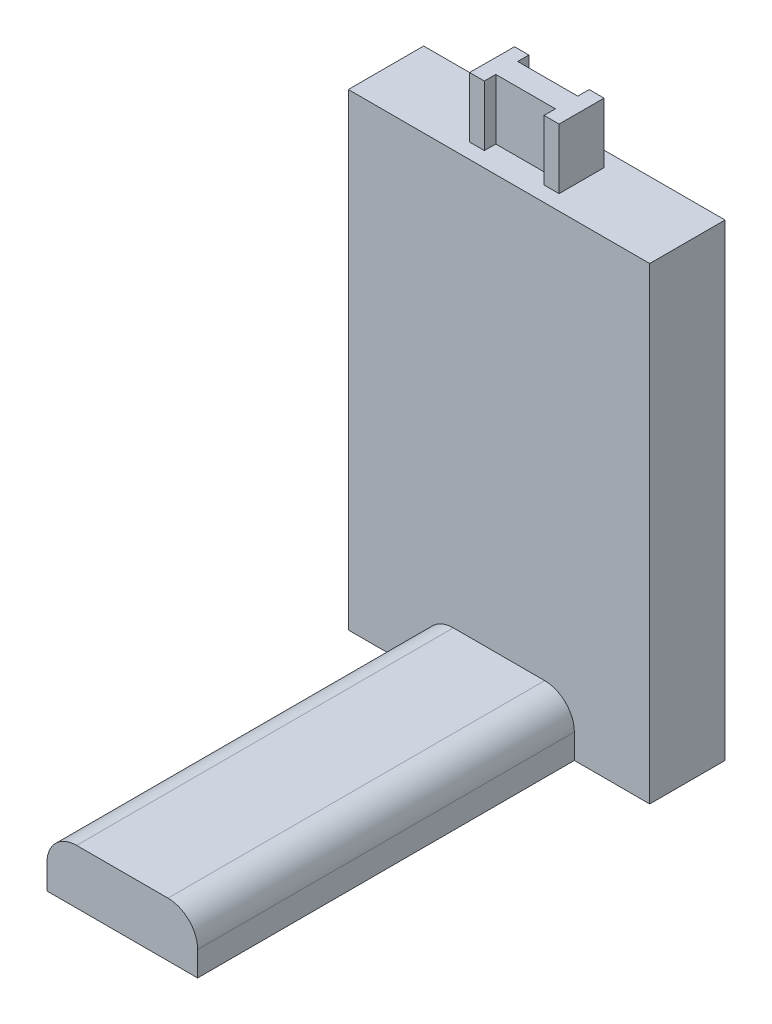
ISO-10303-21;
HEADER;
FILE_DESCRIPTION(('STEP AP214'),'2;1');
FILE_NAME('part.step','',(''),(''),'','','');
FILE_SCHEMA(('AUTOMOTIVE_DESIGN { 1 0 10303 214 1 1 1 1 }'));
ENDSEC;
DATA;
#1=APPLICATION_CONTEXT('core data for automotive mechanical design processes');
#2=APPLICATION_PROTOCOL_DEFINITION('international standard','automotive_design',2000,#1);
#3=PRODUCT_CONTEXT('',#1,'mechanical');
#4=PRODUCT('Part','Part','',(#3));
#5=PRODUCT_RELATED_PRODUCT_CATEGORY('part','',(#4));
#6=PRODUCT_DEFINITION_FORMATION('','',#4);
#7=PRODUCT_DEFINITION_CONTEXT('part definition',#1,'design');
#8=PRODUCT_DEFINITION('design','',#6,#7);
#9=PRODUCT_DEFINITION_SHAPE('','',#8);
#10=(LENGTH_UNIT() NAMED_UNIT(*) SI_UNIT(.MILLI.,.METRE.));
#11=(NAMED_UNIT(*) PLANE_ANGLE_UNIT() SI_UNIT($,.RADIAN.));
#12=(NAMED_UNIT(*) SI_UNIT($,.STERADIAN.) SOLID_ANGLE_UNIT());
#13=UNCERTAINTY_MEASURE_WITH_UNIT(LENGTH_MEASURE(1.E-05),#10,'distance_accuracy_value','');
#14=(GEOMETRIC_REPRESENTATION_CONTEXT(3) GLOBAL_UNCERTAINTY_ASSIGNED_CONTEXT((#13)) GLOBAL_UNIT_ASSIGNED_CONTEXT((#10,
#11,#12)) REPRESENTATION_CONTEXT('',''));
#15=CARTESIAN_POINT('',(0.,0.,0.));
#16=DIRECTION('',(0.,0.,1.));
#17=DIRECTION('',(1.,0.,0.));
#18=AXIS2_PLACEMENT_3D('',#15,#16,#17);
#19=CARTESIAN_POINT('',(10.,8.32158439817525,127.));
#20=DIRECTION('',(0.,0.,1.));
#21=DIRECTION('',(1.,0.,0.));
#22=AXIS2_PLACEMENT_3D('',#19,#20,#21);
#23=CYLINDRICAL_SURFACE('',#22,10.);
#24=DIRECTION('',(0.,0.,1.));
#25=VECTOR('',#24,1.);
#26=CARTESIAN_POINT('',(10.,18.3215843981752,127.));
#27=LINE('',#26,#25);
#28=CARTESIAN_POINT('',(10.,18.3215843981752,0.));
#29=VERTEX_POINT('',#28);
#30=CARTESIAN_POINT('',(10.,18.3215843981752,127.));
#31=VERTEX_POINT('',#30);
#32=EDGE_CURVE('E439',#29,#31,#27,.T.);
#33=ORIENTED_EDGE('',*,*,#32,.F.);
#34=CARTESIAN_POINT('',(10.,8.32158439817525,0.));
#35=DIRECTION('',(0.,0.,-1.));
#36=DIRECTION('',(-1.,0.,0.));
#37=AXIS2_PLACEMENT_3D('',#34,#35,#36);
#38=CIRCLE('',#37,10.);
#39=CARTESIAN_POINT('',(0.,8.32158439817525,0.));
#40=VERTEX_POINT('',#39);
#41=EDGE_CURVE('E11',#29,#40,#38,.F.);
#42=ORIENTED_EDGE('',*,*,#41,.T.);
#43=DIRECTION('',(0.,0.,1.));
#44=VECTOR('',#43,1.);
#45=CARTESIAN_POINT('',(0.,8.32158439817525,127.));
#46=LINE('',#45,#44);
#47=CARTESIAN_POINT('',(0.,8.32158439817525,127.));
#48=VERTEX_POINT('',#47);
#49=EDGE_CURVE('E443',#48,#40,#46,.F.);
#50=ORIENTED_EDGE('',*,*,#49,.F.);
#51=CARTESIAN_POINT('',(10.,8.32158439817525,127.));
#52=DIRECTION('',(0.,0.,1.));
#53=DIRECTION('',(1.,0.,0.));
#54=AXIS2_PLACEMENT_3D('',#51,#52,#53);
#55=CIRCLE('',#54,10.);
#56=EDGE_CURVE('E53',#31,#48,#55,.T.);
#57=ORIENTED_EDGE('',*,*,#56,.F.);
#58=EDGE_LOOP('',(#33,#42,#50,#57));
#59=FACE_BOUND('',#58,.T.);
#60=ADVANCED_FACE('F45',(#59),#23,.T.);
#61=CARTESIAN_POINT('',(40.8,8.32158439817525,127.));
#62=DIRECTION('',(0.,0.,-1.));
#63=DIRECTION('',(-1.,0.,0.));
#64=AXIS2_PLACEMENT_3D('',#61,#62,#63);
#65=CYLINDRICAL_SURFACE('',#64,10.);
#66=DIRECTION('',(0.,0.,-1.));
#67=VECTOR('',#66,1.);
#68=CARTESIAN_POINT('',(40.8,18.3215843981752,127.));
#69=LINE('',#68,#67);
#70=CARTESIAN_POINT('',(40.8,18.3215843981752,127.));
#71=VERTEX_POINT('',#70);
#72=CARTESIAN_POINT('',(40.8,18.3215843981752,0.));
#73=VERTEX_POINT('',#72);
#74=EDGE_CURVE('E425',#71,#73,#69,.T.);
#75=ORIENTED_EDGE('',*,*,#74,.F.);
#76=CARTESIAN_POINT('',(40.8,8.32158439817525,127.));
#77=DIRECTION('',(0.,0.,1.));
#78=DIRECTION('',(1.,0.,0.));
#79=AXIS2_PLACEMENT_3D('',#76,#77,#78);
#80=CIRCLE('',#79,10.);
#81=CARTESIAN_POINT('',(50.8,8.32158439817525,127.));
#82=VERTEX_POINT('',#81);
#83=EDGE_CURVE('E433',#82,#71,#80,.T.);
#84=ORIENTED_EDGE('',*,*,#83,.F.);
#85=DIRECTION('',(0.,0.,-1.));
#86=VECTOR('',#85,1.);
#87=CARTESIAN_POINT('',(50.8,8.32158439817525,127.));
#88=LINE('',#87,#86);
#89=CARTESIAN_POINT('',(50.8,8.32158439817525,0.));
#90=VERTEX_POINT('',#89);
#91=EDGE_CURVE('E429',#90,#82,#88,.F.);
#92=ORIENTED_EDGE('',*,*,#91,.F.);
#93=CARTESIAN_POINT('',(40.8,8.32158439817525,0.));
#94=DIRECTION('',(0.,0.,-1.));
#95=DIRECTION('',(-1.,0.,0.));
#96=AXIS2_PLACEMENT_3D('',#93,#94,#95);
#97=CIRCLE('',#96,10.);
#98=EDGE_CURVE('E436',#90,#73,#97,.F.);
#99=ORIENTED_EDGE('',*,*,#98,.T.);
#100=EDGE_LOOP('',(#75,#84,#92,#99));
#101=FACE_BOUND('',#100,.T.);
#102=ADVANCED_FACE('F476',(#101),#65,.T.);
#103=CARTESIAN_POINT('',(-25.4,157.8,0.));
#104=DIRECTION('',(0.,0.,-1.));
#105=DIRECTION('',(-1.,0.,0.));
#106=AXIS2_PLACEMENT_3D('',#103,#104,#105);
#107=PLANE('',#106);
#108=DIRECTION('',(0.,1.,0.));
#109=VECTOR('',#108,1.);
#110=CARTESIAN_POINT('',(50.8,18.3215843981752,0.));
#111=LINE('',#110,#109);
#112=CARTESIAN_POINT('',(50.8,0.,0.));
#113=VERTEX_POINT('',#112);
#114=EDGE_CURVE('E223',#113,#90,#111,.T.);
#115=ORIENTED_EDGE('',*,*,#114,.F.);
#116=DIRECTION('',(1.,0.,0.));
#117=VECTOR('',#116,1.);
#118=CARTESIAN_POINT('',(-25.4,0.,0.));
#119=LINE('',#118,#117);
#120=CARTESIAN_POINT('',(76.2,0.,0.));
#121=VERTEX_POINT('',#120);
#122=EDGE_CURVE('E407',#113,#121,#119,.T.);
#123=ORIENTED_EDGE('',*,*,#122,.T.);
#124=DIRECTION('',(0.,-1.,0.));
#125=VECTOR('',#124,1.);
#126=CARTESIAN_POINT('',(76.2,157.8,0.));
#127=LINE('',#126,#125);
#128=CARTESIAN_POINT('',(76.2,157.8,0.));
#129=VERTEX_POINT('',#128);
#130=EDGE_CURVE('E397',#129,#121,#127,.T.);
#131=ORIENTED_EDGE('',*,*,#130,.F.);
#132=DIRECTION('',(1.,0.,0.));
#133=VECTOR('',#132,1.);
#134=CARTESIAN_POINT('',(-25.4,157.8,0.));
#135=LINE('',#134,#133);
#136=CARTESIAN_POINT('',(-25.4,157.8,0.));
#137=VERTEX_POINT('',#136);
#138=EDGE_CURVE('E394',#137,#129,#135,.T.);
#139=ORIENTED_EDGE('',*,*,#138,.F.);
#140=DIRECTION('',(0.,-1.,0.));
#141=VECTOR('',#140,1.);
#142=CARTESIAN_POINT('',(-25.4,157.8,0.));
#143=LINE('',#142,#141);
#144=CARTESIAN_POINT('',(-25.4,0.,0.));
#145=VERTEX_POINT('',#144);
#146=EDGE_CURVE('E413',#137,#145,#143,.T.);
#147=ORIENTED_EDGE('',*,*,#146,.T.);
#148=CARTESIAN_POINT('',(0.,0.,0.));
#149=VERTEX_POINT('',#148);
#150=EDGE_CURVE('E388',#145,#149,#119,.T.);
#151=ORIENTED_EDGE('',*,*,#150,.T.);
#152=DIRECTION('',(0.,-1.,0.));
#153=VECTOR('',#152,1.);
#154=CARTESIAN_POINT('',(0.,18.3215843981752,0.));
#155=LINE('',#154,#153);
#156=EDGE_CURVE('E204',#40,#149,#155,.T.);
#157=ORIENTED_EDGE('',*,*,#156,.F.);
#158=ORIENTED_EDGE('',*,*,#41,.F.);
#159=DIRECTION('',(-1.,0.,0.));
#160=VECTOR('',#159,1.);
#161=CARTESIAN_POINT('',(0.,18.3215843981752,0.));
#162=LINE('',#161,#160);
#163=EDGE_CURVE('E227',#73,#29,#162,.T.);
#164=ORIENTED_EDGE('',*,*,#163,.F.);
#165=ORIENTED_EDGE('',*,*,#98,.F.);
#166=EDGE_LOOP('',(#115,#123,#131,#139,#147,#151,#157,#158,#164,#165));
#167=FACE_BOUND('',#166,.T.);
#168=ADVANCED_FACE('F449',(#167),#107,.F.);
#169=CARTESIAN_POINT('',(76.2,157.8,-25.4));
#170=DIRECTION('',(-1.,0.,0.));
#171=DIRECTION('',(0.,0.,1.));
#172=AXIS2_PLACEMENT_3D('',#169,#170,#171);
#173=PLANE('',#172);
#174=DIRECTION('',(0.,0.,-1.));
#175=VECTOR('',#174,1.);
#176=CARTESIAN_POINT('',(76.2,0.,-25.4));
#177=LINE('',#176,#175);
#178=CARTESIAN_POINT('',(76.2,0.,-25.4));
#179=VERTEX_POINT('',#178);
#180=EDGE_CURVE('E382',#121,#179,#177,.T.);
#181=ORIENTED_EDGE('',*,*,#180,.T.);
#182=DIRECTION('',(0.,-1.,0.));
#183=VECTOR('',#182,1.);
#184=CARTESIAN_POINT('',(76.2,157.8,-25.4));
#185=LINE('',#184,#183);
#186=CARTESIAN_POINT('',(76.2,157.8,-25.4));
#187=VERTEX_POINT('',#186);
#188=EDGE_CURVE('E421',#187,#179,#185,.T.);
#189=ORIENTED_EDGE('',*,*,#188,.F.);
#190=DIRECTION('',(0.,0.,-1.));
#191=VECTOR('',#190,1.);
#192=CARTESIAN_POINT('',(76.2,157.8,-25.4));
#193=LINE('',#192,#191);
#194=EDGE_CURVE('E383',#129,#187,#193,.T.);
#195=ORIENTED_EDGE('',*,*,#194,.F.);
#196=ORIENTED_EDGE('',*,*,#130,.T.);
#197=EDGE_LOOP('',(#181,#189,#195,#196));
#198=FACE_BOUND('',#197,.T.);
#199=ADVANCED_FACE('F453',(#198),#173,.F.);
#200=CARTESIAN_POINT('',(-25.4,157.8,-25.4));
#201=DIRECTION('',(0.,0.,1.));
#202=DIRECTION('',(1.,0.,0.));
#203=AXIS2_PLACEMENT_3D('',#200,#201,#202);
#204=PLANE('',#203);
#205=DIRECTION('',(-1.,0.,0.));
#206=VECTOR('',#205,1.);
#207=CARTESIAN_POINT('',(-25.4,0.,-25.4));
#208=LINE('',#207,#206);
#209=CARTESIAN_POINT('',(-25.4,0.,-25.4));
#210=VERTEX_POINT('',#209);
#211=EDGE_CURVE('E401',#179,#210,#208,.T.);
#212=ORIENTED_EDGE('',*,*,#211,.T.);
#213=DIRECTION('',(0.,-1.,0.));
#214=VECTOR('',#213,1.);
#215=CARTESIAN_POINT('',(-25.4,157.8,-25.4));
#216=LINE('',#215,#214);
#217=CARTESIAN_POINT('',(-25.4,157.8,-25.4));
#218=VERTEX_POINT('',#217);
#219=EDGE_CURVE('E417',#218,#210,#216,.T.);
#220=ORIENTED_EDGE('',*,*,#219,.F.);
#221=DIRECTION('',(-1.,0.,0.));
#222=VECTOR('',#221,1.);
#223=CARTESIAN_POINT('',(-25.4,157.8,-25.4));
#224=LINE('',#223,#222);
#225=EDGE_CURVE('E387',#187,#218,#224,.T.);
#226=ORIENTED_EDGE('',*,*,#225,.F.);
#227=ORIENTED_EDGE('',*,*,#188,.T.);
#228=EDGE_LOOP('',(#212,#220,#226,#227));
#229=FACE_BOUND('',#228,.T.);
#230=ADVANCED_FACE('F458',(#229),#204,.F.);
#231=CARTESIAN_POINT('',(-25.4,157.8,0.));
#232=DIRECTION('',(1.,0.,0.));
#233=DIRECTION('',(0.,0.,-1.));
#234=AXIS2_PLACEMENT_3D('',#231,#232,#233);
#235=PLANE('',#234);
#236=DIRECTION('',(0.,0.,1.));
#237=VECTOR('',#236,1.);
#238=CARTESIAN_POINT('',(-25.4,0.,0.));
#239=LINE('',#238,#237);
#240=EDGE_CURVE('E404',#210,#145,#239,.T.);
#241=ORIENTED_EDGE('',*,*,#240,.T.);
#242=ORIENTED_EDGE('',*,*,#146,.F.);
#243=DIRECTION('',(0.,0.,1.));
#244=VECTOR('',#243,1.);
#245=CARTESIAN_POINT('',(-25.4,157.8,0.));
#246=LINE('',#245,#244);
#247=EDGE_CURVE('E391',#218,#137,#246,.T.);
#248=ORIENTED_EDGE('',*,*,#247,.F.);
#249=ORIENTED_EDGE('',*,*,#219,.T.);
#250=EDGE_LOOP('',(#241,#242,#248,#249));
#251=FACE_BOUND('',#250,.T.);
#252=ADVANCED_FACE('F464',(#251),#235,.F.);
#253=CARTESIAN_POINT('',(0.,157.8,0.));
#254=DIRECTION('',(0.,1.,0.));
#255=DIRECTION('',(0.,0.,1.));
#256=AXIS2_PLACEMENT_3D('',#253,#254,#255);
#257=PLANE('',#256);
#258=DIRECTION('',(-0.00390174965338652,0.,0.999992388145851));
#259=VECTOR('',#258,1.);
#260=CARTESIAN_POINT('',(10.3887668141845,157.8,-5.08731838640076));
#261=LINE('',#260,#259);
#262=CARTESIAN_POINT('',(10.447692891702,157.8,-20.1896786646093));
#263=VERTEX_POINT('',#262);
#264=CARTESIAN_POINT('',(10.3887668141845,157.8,-5.08731838640076));
#265=VERTEX_POINT('',#264);
#266=EDGE_CURVE('E238',#263,#265,#261,.T.);
#267=ORIENTED_EDGE('',*,*,#266,.F.);
#268=DIRECTION('',(-1.,0.,0.));
#269=VECTOR('',#268,1.);
#270=CARTESIAN_POINT('',(10.447692891702,157.8,-20.1896786646093));
#271=LINE('',#270,#269);
#272=CARTESIAN_POINT('',(15.2935340648002,157.8,-20.1896786646093));
#273=VERTEX_POINT('',#272);
#274=EDGE_CURVE('E255',#273,#263,#271,.T.);
#275=ORIENTED_EDGE('',*,*,#274,.F.);
#276=DIRECTION('',(0.,0.,-1.));
#277=VECTOR('',#276,1.);
#278=CARTESIAN_POINT('',(15.2935340648002,157.8,-20.1896786646093));
#279=LINE('',#278,#277);
#280=CARTESIAN_POINT('',(15.2935340648002,157.8,-16.4095895020894));
#281=VERTEX_POINT('',#280);
#282=EDGE_CURVE('E328',#281,#273,#279,.T.);
#283=ORIENTED_EDGE('',*,*,#282,.F.);
#284=DIRECTION('',(-1.,0.,0.));
#285=VECTOR('',#284,1.);
#286=CARTESIAN_POINT('',(15.2935340648002,157.8,-16.4095895020894));
#287=LINE('',#286,#285);
#288=CARTESIAN_POINT('',(35.5270404867116,157.8,-16.4095895020894));
#289=VERTEX_POINT('',#288);
#290=EDGE_CURVE('E324',#289,#281,#287,.T.);
#291=ORIENTED_EDGE('',*,*,#290,.F.);
#292=DIRECTION('',(0.,0.,1.));
#293=VECTOR('',#292,1.);
#294=CARTESIAN_POINT('',(35.5270404867116,157.8,-16.4095895020894));
#295=LINE('',#294,#293);
#296=CARTESIAN_POINT('',(35.5270404867116,157.8,-20.2636190627477));
#297=VERTEX_POINT('',#296);
#298=EDGE_CURVE('E320',#297,#289,#295,.T.);
#299=ORIENTED_EDGE('',*,*,#298,.F.);
#300=DIRECTION('',(-1.,0.,0.));
#301=VECTOR('',#300,1.);
#302=CARTESIAN_POINT('',(35.5270404867116,157.8,-20.2636190627477));
#303=LINE('',#302,#301);
#304=CARTESIAN_POINT('',(40.5334306115716,157.8,-20.2636190627477));
#305=VERTEX_POINT('',#304);
#306=EDGE_CURVE('E316',#305,#297,#303,.T.);
#307=ORIENTED_EDGE('',*,*,#306,.F.);
#308=DIRECTION('',(0.,0.,-1.));
#309=VECTOR('',#308,1.);
#310=CARTESIAN_POINT('',(40.5334306115716,157.8,-20.2636190627477));
#311=LINE('',#310,#309);
#312=CARTESIAN_POINT('',(40.5334306115716,157.8,-5.11457402488085));
#313=VERTEX_POINT('',#312);
#314=EDGE_CURVE('E312',#313,#305,#311,.T.);
#315=ORIENTED_EDGE('',*,*,#314,.F.);
#316=DIRECTION('',(1.,0.,0.));
#317=VECTOR('',#316,1.);
#318=CARTESIAN_POINT('',(40.5334306115716,157.8,-5.11457402488085));
#319=LINE('',#318,#317);
#320=CARTESIAN_POINT('',(35.4601100970577,157.8,-5.11457402488085));
#321=VERTEX_POINT('',#320);
#322=EDGE_CURVE('E308',#321,#313,#319,.T.);
#323=ORIENTED_EDGE('',*,*,#322,.F.);
#324=DIRECTION('',(0.,0.,1.));
#325=VECTOR('',#324,1.);
#326=CARTESIAN_POINT('',(35.4601100970577,157.8,-5.11457402488085));
#327=LINE('',#326,#325);
#328=CARTESIAN_POINT('',(35.4601100970577,157.8,-8.94221759369022));
#329=VERTEX_POINT('',#328);
#330=EDGE_CURVE('E304',#329,#321,#327,.T.);
#331=ORIENTED_EDGE('',*,*,#330,.F.);
#332=DIRECTION('',(1.,0.,0.));
#333=VECTOR('',#332,1.);
#334=CARTESIAN_POINT('',(35.4601100970577,157.8,-8.94221759369022));
#335=LINE('',#334,#333);
#336=CARTESIAN_POINT('',(15.3671975774916,157.8,-8.94221759369022));
#337=VERTEX_POINT('',#336);
#338=EDGE_CURVE('E300',#337,#329,#335,.T.);
#339=ORIENTED_EDGE('',*,*,#338,.F.);
#340=DIRECTION('',(0.,0.,-1.));
#341=VECTOR('',#340,1.);
#342=CARTESIAN_POINT('',(15.3671975774916,157.8,-8.94221759369022));
#343=LINE('',#342,#341);
#344=CARTESIAN_POINT('',(15.3671975774916,157.8,-5.08731838640076));
#345=VERTEX_POINT('',#344);
#346=EDGE_CURVE('E296',#345,#337,#343,.T.);
#347=ORIENTED_EDGE('',*,*,#346,.F.);
#348=DIRECTION('',(1.,0.,0.));
#349=VECTOR('',#348,1.);
#350=CARTESIAN_POINT('',(15.3671975774916,157.8,-5.08731838640076));
#351=LINE('',#350,#349);
#352=EDGE_CURVE('E292',#265,#345,#351,.T.);
#353=ORIENTED_EDGE('',*,*,#352,.F.);
#354=EDGE_LOOP('',(#267,#275,#283,#291,#299,#307,#315,#323,#331,#339,#347,#353));
#355=FACE_BOUND('',#354,.T.);
#356=ORIENTED_EDGE('',*,*,#194,.T.);
#357=ORIENTED_EDGE('',*,*,#225,.T.);
#358=ORIENTED_EDGE('',*,*,#247,.T.);
#359=ORIENTED_EDGE('',*,*,#138,.T.);
#360=EDGE_LOOP('',(#356,#357,#358,#359));
#361=FACE_BOUND('',#360,.T.);
#362=ADVANCED_FACE('F461',(#355,#361),#257,.T.);
#363=CARTESIAN_POINT('',(0.,0.,0.));
#364=DIRECTION('',(0.,1.,0.));
#365=DIRECTION('',(0.,0.,1.));
#366=AXIS2_PLACEMENT_3D('',#363,#364,#365);
#367=PLANE('',#366);
#368=CARTESIAN_POINT('',(55.88,0.,-12.7));
#369=DIRECTION('',(0.,-1.,0.));
#370=DIRECTION('',(0.,0.,-1.));
#371=AXIS2_PLACEMENT_3D('',#368,#369,#370);
#372=CIRCLE('',#371,5.207);
#373=CARTESIAN_POINT('',(55.88,0.,-17.907));
#374=VERTEX_POINT('',#373);
#375=EDGE_CURVE('E239',#374,#374,#372,.T.);
#376=ORIENTED_EDGE('',*,*,#375,.F.);
#377=EDGE_LOOP('',(#376));
#378=FACE_BOUND('',#377,.T.);
#379=CARTESIAN_POINT('',(-5.08,0.,-12.7));
#380=DIRECTION('',(0.,-1.,0.));
#381=DIRECTION('',(0.,0.,-1.));
#382=AXIS2_PLACEMENT_3D('',#379,#380,#381);
#383=CIRCLE('',#382,5.207);
#384=CARTESIAN_POINT('',(-5.08,0.,-17.907));
#385=VERTEX_POINT('',#384);
#386=EDGE_CURVE('E243',#385,#385,#383,.T.);
#387=ORIENTED_EDGE('',*,*,#386,.F.);
#388=EDGE_LOOP('',(#387));
#389=FACE_BOUND('',#388,.T.);
#390=ORIENTED_EDGE('',*,*,#180,.F.);
#391=ORIENTED_EDGE('',*,*,#122,.F.);
#392=DIRECTION('',(0.,0.,-1.));
#393=VECTOR('',#392,1.);
#394=CARTESIAN_POINT('',(50.8,0.,127.));
#395=LINE('',#394,#393);
#396=CARTESIAN_POINT('',(50.8,0.,127.));
#397=VERTEX_POINT('',#396);
#398=EDGE_CURVE('E210',#397,#113,#395,.T.);
#399=ORIENTED_EDGE('',*,*,#398,.F.);
#400=DIRECTION('',(1.,0.,0.));
#401=VECTOR('',#400,1.);
#402=CARTESIAN_POINT('',(0.,0.,127.));
#403=LINE('',#402,#401);
#404=CARTESIAN_POINT('',(0.,0.,127.));
#405=VERTEX_POINT('',#404);
#406=EDGE_CURVE('E194',#405,#397,#403,.T.);
#407=ORIENTED_EDGE('',*,*,#406,.F.);
#408=DIRECTION('',(0.,0.,-1.));
#409=VECTOR('',#408,1.);
#410=CARTESIAN_POINT('',(0.,0.,127.));
#411=LINE('',#410,#409);
#412=EDGE_CURVE('E201',#405,#149,#411,.T.);
#413=ORIENTED_EDGE('',*,*,#412,.T.);
#414=ORIENTED_EDGE('',*,*,#150,.F.);
#415=ORIENTED_EDGE('',*,*,#240,.F.);
#416=ORIENTED_EDGE('',*,*,#211,.F.);
#417=EDGE_LOOP('',(#390,#391,#399,#407,#413,#414,#415,#416));
#418=FACE_BOUND('',#417,.T.);
#419=ADVANCED_FACE('F213',(#378,#389,#418),#367,.F.);
#420=CARTESIAN_POINT('',(10.3887668141845,178.12,-5.08731838640076));
#421=DIRECTION('',(0.999992388145851,0.,0.00390174965338652));
#422=DIRECTION('',(0.00390174965338652,0.,-0.999992388145851));
#423=AXIS2_PLACEMENT_3D('',#420,#421,#422);
#424=PLANE('',#423);
#425=ORIENTED_EDGE('',*,*,#266,.T.);
#426=DIRECTION('',(0.,-1.,0.));
#427=VECTOR('',#426,1.);
#428=CARTESIAN_POINT('',(10.3887668141845,178.12,-5.08731838640076));
#429=LINE('',#428,#427);
#430=CARTESIAN_POINT('',(10.3887668141845,178.12,-5.08731838640076));
#431=VERTEX_POINT('',#430);
#432=EDGE_CURVE('E378',#431,#265,#429,.T.);
#433=ORIENTED_EDGE('',*,*,#432,.F.);
#434=DIRECTION('',(-0.00390174965338652,0.,0.999992388145851));
#435=VECTOR('',#434,1.);
#436=CARTESIAN_POINT('',(10.3887668141845,178.12,-5.08731838640076));
#437=LINE('',#436,#435);
#438=CARTESIAN_POINT('',(10.447692891702,178.12,-20.1896786646093));
#439=VERTEX_POINT('',#438);
#440=EDGE_CURVE('E250',#439,#431,#437,.T.);
#441=ORIENTED_EDGE('',*,*,#440,.F.);
#442=DIRECTION('',(0.,-1.,0.));
#443=VECTOR('',#442,1.);
#444=CARTESIAN_POINT('',(10.447692891702,178.12,-20.1896786646093));
#445=LINE('',#444,#443);
#446=EDGE_CURVE('E288',#439,#263,#445,.T.);
#447=ORIENTED_EDGE('',*,*,#446,.T.);
#448=EDGE_LOOP('',(#425,#433,#441,#447));
#449=FACE_BOUND('',#448,.T.);
#450=ADVANCED_FACE('F564',(#449),#424,.F.);
#451=CARTESIAN_POINT('',(15.3671975774916,178.12,-5.08731838640076));
#452=DIRECTION('',(0.,0.,-1.));
#453=DIRECTION('',(-1.,0.,0.));
#454=AXIS2_PLACEMENT_3D('',#451,#452,#453);
#455=PLANE('',#454);
#456=ORIENTED_EDGE('',*,*,#352,.T.);
#457=DIRECTION('',(0.,-1.,0.));
#458=VECTOR('',#457,1.);
#459=CARTESIAN_POINT('',(15.3671975774916,178.12,-5.08731838640076));
#460=LINE('',#459,#458);
#461=CARTESIAN_POINT('',(15.3671975774916,178.12,-5.08731838640076));
#462=VERTEX_POINT('',#461);
#463=EDGE_CURVE('E374',#462,#345,#460,.T.);
#464=ORIENTED_EDGE('',*,*,#463,.F.);
#465=DIRECTION('',(1.,0.,0.));
#466=VECTOR('',#465,1.);
#467=CARTESIAN_POINT('',(15.3671975774916,178.12,-5.08731838640076));
#468=LINE('',#467,#466);
#469=EDGE_CURVE('E254',#431,#462,#468,.T.);
#470=ORIENTED_EDGE('',*,*,#469,.F.);
#471=ORIENTED_EDGE('',*,*,#432,.T.);
#472=EDGE_LOOP('',(#456,#464,#470,#471));
#473=FACE_BOUND('',#472,.T.);
#474=ADVANCED_FACE('F560',(#473),#455,.F.);
#475=CARTESIAN_POINT('',(15.3671975774916,178.12,-8.94221759369022));
#476=DIRECTION('',(-1.,0.,0.));
#477=DIRECTION('',(0.,0.,1.));
#478=AXIS2_PLACEMENT_3D('',#475,#476,#477);
#479=PLANE('',#478);
#480=ORIENTED_EDGE('',*,*,#346,.T.);
#481=DIRECTION('',(0.,-1.,0.));
#482=VECTOR('',#481,1.);
#483=CARTESIAN_POINT('',(15.3671975774916,178.12,-8.94221759369022));
#484=LINE('',#483,#482);
#485=CARTESIAN_POINT('',(15.3671975774916,178.12,-8.94221759369022));
#486=VERTEX_POINT('',#485);
#487=EDGE_CURVE('E370',#486,#337,#484,.T.);
#488=ORIENTED_EDGE('',*,*,#487,.F.);
#489=DIRECTION('',(0.,0.,-1.));
#490=VECTOR('',#489,1.);
#491=CARTESIAN_POINT('',(15.3671975774916,178.12,-8.94221759369022));
#492=LINE('',#491,#490);
#493=EDGE_CURVE('E258',#462,#486,#492,.T.);
#494=ORIENTED_EDGE('',*,*,#493,.F.);
#495=ORIENTED_EDGE('',*,*,#463,.T.);
#496=EDGE_LOOP('',(#480,#488,#494,#495));
#497=FACE_BOUND('',#496,.T.);
#498=ADVANCED_FACE('F556',(#497),#479,.F.);
#499=CARTESIAN_POINT('',(35.4601100970577,178.12,-8.94221759369022));
#500=DIRECTION('',(0.,0.,-1.));
#501=DIRECTION('',(-1.,0.,0.));
#502=AXIS2_PLACEMENT_3D('',#499,#500,#501);
#503=PLANE('',#502);
#504=ORIENTED_EDGE('',*,*,#338,.T.);
#505=DIRECTION('',(0.,-1.,0.));
#506=VECTOR('',#505,1.);
#507=CARTESIAN_POINT('',(35.4601100970577,178.12,-8.94221759369022));
#508=LINE('',#507,#506);
#509=CARTESIAN_POINT('',(35.4601100970577,178.12,-8.94221759369022));
#510=VERTEX_POINT('',#509);
#511=EDGE_CURVE('E366',#510,#329,#508,.T.);
#512=ORIENTED_EDGE('',*,*,#511,.F.);
#513=DIRECTION('',(1.,0.,0.));
#514=VECTOR('',#513,1.);
#515=CARTESIAN_POINT('',(35.4601100970577,178.12,-8.94221759369022));
#516=LINE('',#515,#514);
#517=EDGE_CURVE('E261',#486,#510,#516,.T.);
#518=ORIENTED_EDGE('',*,*,#517,.F.);
#519=ORIENTED_EDGE('',*,*,#487,.T.);
#520=EDGE_LOOP('',(#504,#512,#518,#519));
#521=FACE_BOUND('',#520,.T.);
#522=ADVANCED_FACE('F552',(#521),#503,.F.);
#523=CARTESIAN_POINT('',(35.4601100970577,178.12,-5.11457402488085));
#524=DIRECTION('',(1.,0.,0.));
#525=DIRECTION('',(0.,0.,-1.));
#526=AXIS2_PLACEMENT_3D('',#523,#524,#525);
#527=PLANE('',#526);
#528=ORIENTED_EDGE('',*,*,#330,.T.);
#529=DIRECTION('',(0.,-1.,0.));
#530=VECTOR('',#529,1.);
#531=CARTESIAN_POINT('',(35.4601100970577,178.12,-5.11457402488085));
#532=LINE('',#531,#530);
#533=CARTESIAN_POINT('',(35.4601100970577,178.12,-5.11457402488085));
#534=VERTEX_POINT('',#533);
#535=EDGE_CURVE('E362',#534,#321,#532,.T.);
#536=ORIENTED_EDGE('',*,*,#535,.F.);
#537=DIRECTION('',(0.,0.,1.));
#538=VECTOR('',#537,1.);
#539=CARTESIAN_POINT('',(35.4601100970577,178.12,-5.11457402488085));
#540=LINE('',#539,#538);
#541=EDGE_CURVE('E264',#510,#534,#540,.T.);
#542=ORIENTED_EDGE('',*,*,#541,.F.);
#543=ORIENTED_EDGE('',*,*,#511,.T.);
#544=EDGE_LOOP('',(#528,#536,#542,#543));
#545=FACE_BOUND('',#544,.T.);
#546=ADVANCED_FACE('F548',(#545),#527,.F.);
#547=CARTESIAN_POINT('',(40.5334306115716,178.12,-5.11457402488085));
#548=DIRECTION('',(0.,0.,-1.));
#549=DIRECTION('',(-1.,0.,0.));
#550=AXIS2_PLACEMENT_3D('',#547,#548,#549);
#551=PLANE('',#550);
#552=ORIENTED_EDGE('',*,*,#322,.T.);
#553=DIRECTION('',(0.,-1.,0.));
#554=VECTOR('',#553,1.);
#555=CARTESIAN_POINT('',(40.5334306115716,178.12,-5.11457402488085));
#556=LINE('',#555,#554);
#557=CARTESIAN_POINT('',(40.5334306115716,178.12,-5.11457402488085));
#558=VERTEX_POINT('',#557);
#559=EDGE_CURVE('E358',#558,#313,#556,.T.);
#560=ORIENTED_EDGE('',*,*,#559,.F.);
#561=DIRECTION('',(1.,0.,0.));
#562=VECTOR('',#561,1.);
#563=CARTESIAN_POINT('',(40.5334306115716,178.12,-5.11457402488085));
#564=LINE('',#563,#562);
#565=EDGE_CURVE('E267',#534,#558,#564,.T.);
#566=ORIENTED_EDGE('',*,*,#565,.F.);
#567=ORIENTED_EDGE('',*,*,#535,.T.);
#568=EDGE_LOOP('',(#552,#560,#566,#567));
#569=FACE_BOUND('',#568,.T.);
#570=ADVANCED_FACE('F544',(#569),#551,.F.);
#571=CARTESIAN_POINT('',(40.5334306115716,178.12,-20.2636190627477));
#572=DIRECTION('',(-1.,0.,0.));
#573=DIRECTION('',(0.,0.,1.));
#574=AXIS2_PLACEMENT_3D('',#571,#572,#573);
#575=PLANE('',#574);
#576=ORIENTED_EDGE('',*,*,#314,.T.);
#577=DIRECTION('',(0.,-1.,0.));
#578=VECTOR('',#577,1.);
#579=CARTESIAN_POINT('',(40.5334306115716,178.12,-20.2636190627477));
#580=LINE('',#579,#578);
#581=CARTESIAN_POINT('',(40.5334306115716,178.12,-20.2636190627477));
#582=VERTEX_POINT('',#581);
#583=EDGE_CURVE('E354',#582,#305,#580,.T.);
#584=ORIENTED_EDGE('',*,*,#583,.F.);
#585=DIRECTION('',(0.,0.,-1.));
#586=VECTOR('',#585,1.);
#587=CARTESIAN_POINT('',(40.5334306115716,178.12,-20.2636190627477));
#588=LINE('',#587,#586);
#589=EDGE_CURVE('E270',#558,#582,#588,.T.);
#590=ORIENTED_EDGE('',*,*,#589,.F.);
#591=ORIENTED_EDGE('',*,*,#559,.T.);
#592=EDGE_LOOP('',(#576,#584,#590,#591));
#593=FACE_BOUND('',#592,.T.);
#594=ADVANCED_FACE('F540',(#593),#575,.F.);
#595=CARTESIAN_POINT('',(35.5270404867116,178.12,-20.2636190627477));
#596=DIRECTION('',(0.,0.,1.));
#597=DIRECTION('',(1.,0.,0.));
#598=AXIS2_PLACEMENT_3D('',#595,#596,#597);
#599=PLANE('',#598);
#600=ORIENTED_EDGE('',*,*,#306,.T.);
#601=DIRECTION('',(0.,-1.,0.));
#602=VECTOR('',#601,1.);
#603=CARTESIAN_POINT('',(35.5270404867116,178.12,-20.2636190627477));
#604=LINE('',#603,#602);
#605=CARTESIAN_POINT('',(35.5270404867116,178.12,-20.2636190627477));
#606=VERTEX_POINT('',#605);
#607=EDGE_CURVE('E350',#606,#297,#604,.T.);
#608=ORIENTED_EDGE('',*,*,#607,.F.);
#609=DIRECTION('',(-1.,0.,0.));
#610=VECTOR('',#609,1.);
#611=CARTESIAN_POINT('',(35.5270404867116,178.12,-20.2636190627477));
#612=LINE('',#611,#610);
#613=EDGE_CURVE('E273',#582,#606,#612,.T.);
#614=ORIENTED_EDGE('',*,*,#613,.F.);
#615=ORIENTED_EDGE('',*,*,#583,.T.);
#616=EDGE_LOOP('',(#600,#608,#614,#615));
#617=FACE_BOUND('',#616,.T.);
#618=ADVANCED_FACE('F536',(#617),#599,.F.);
#619=CARTESIAN_POINT('',(35.5270404867116,178.12,-16.4095895020894));
#620=DIRECTION('',(1.,0.,0.));
#621=DIRECTION('',(0.,0.,-1.));
#622=AXIS2_PLACEMENT_3D('',#619,#620,#621);
#623=PLANE('',#622);
#624=ORIENTED_EDGE('',*,*,#298,.T.);
#625=DIRECTION('',(0.,-1.,0.));
#626=VECTOR('',#625,1.);
#627=CARTESIAN_POINT('',(35.5270404867116,178.12,-16.4095895020894));
#628=LINE('',#627,#626);
#629=CARTESIAN_POINT('',(35.5270404867116,178.12,-16.4095895020894));
#630=VERTEX_POINT('',#629);
#631=EDGE_CURVE('E346',#630,#289,#628,.T.);
#632=ORIENTED_EDGE('',*,*,#631,.F.);
#633=DIRECTION('',(0.,0.,1.));
#634=VECTOR('',#633,1.);
#635=CARTESIAN_POINT('',(35.5270404867116,178.12,-16.4095895020894));
#636=LINE('',#635,#634);
#637=EDGE_CURVE('E276',#606,#630,#636,.T.);
#638=ORIENTED_EDGE('',*,*,#637,.F.);
#639=ORIENTED_EDGE('',*,*,#607,.T.);
#640=EDGE_LOOP('',(#624,#632,#638,#639));
#641=FACE_BOUND('',#640,.T.);
#642=ADVANCED_FACE('F532',(#641),#623,.F.);
#643=CARTESIAN_POINT('',(15.2935340648002,178.12,-16.4095895020894));
#644=DIRECTION('',(0.,0.,1.));
#645=DIRECTION('',(1.,0.,0.));
#646=AXIS2_PLACEMENT_3D('',#643,#644,#645);
#647=PLANE('',#646);
#648=ORIENTED_EDGE('',*,*,#290,.T.);
#649=DIRECTION('',(0.,-1.,0.));
#650=VECTOR('',#649,1.);
#651=CARTESIAN_POINT('',(15.2935340648002,178.12,-16.4095895020894));
#652=LINE('',#651,#650);
#653=CARTESIAN_POINT('',(15.2935340648002,178.12,-16.4095895020894));
#654=VERTEX_POINT('',#653);
#655=EDGE_CURVE('E342',#654,#281,#652,.T.);
#656=ORIENTED_EDGE('',*,*,#655,.F.);
#657=DIRECTION('',(-1.,0.,0.));
#658=VECTOR('',#657,1.);
#659=CARTESIAN_POINT('',(15.2935340648002,178.12,-16.4095895020894));
#660=LINE('',#659,#658);
#661=EDGE_CURVE('E279',#630,#654,#660,.T.);
#662=ORIENTED_EDGE('',*,*,#661,.F.);
#663=ORIENTED_EDGE('',*,*,#631,.T.);
#664=EDGE_LOOP('',(#648,#656,#662,#663));
#665=FACE_BOUND('',#664,.T.);
#666=ADVANCED_FACE('F528',(#665),#647,.F.);
#667=CARTESIAN_POINT('',(15.2935340648002,178.12,-20.1896786646093));
#668=DIRECTION('',(-1.,0.,0.));
#669=DIRECTION('',(0.,0.,1.));
#670=AXIS2_PLACEMENT_3D('',#667,#668,#669);
#671=PLANE('',#670);
#672=ORIENTED_EDGE('',*,*,#282,.T.);
#673=DIRECTION('',(0.,-1.,0.));
#674=VECTOR('',#673,1.);
#675=CARTESIAN_POINT('',(15.2935340648002,178.12,-20.1896786646093));
#676=LINE('',#675,#674);
#677=CARTESIAN_POINT('',(15.2935340648002,178.12,-20.1896786646093));
#678=VERTEX_POINT('',#677);
#679=EDGE_CURVE('E338',#678,#273,#676,.T.);
#680=ORIENTED_EDGE('',*,*,#679,.F.);
#681=DIRECTION('',(0.,0.,-1.));
#682=VECTOR('',#681,1.);
#683=CARTESIAN_POINT('',(15.2935340648002,178.12,-20.1896786646093));
#684=LINE('',#683,#682);
#685=EDGE_CURVE('E282',#654,#678,#684,.T.);
#686=ORIENTED_EDGE('',*,*,#685,.F.);
#687=ORIENTED_EDGE('',*,*,#655,.T.);
#688=EDGE_LOOP('',(#672,#680,#686,#687));
#689=FACE_BOUND('',#688,.T.);
#690=ADVANCED_FACE('F524',(#689),#671,.F.);
#691=CARTESIAN_POINT('',(10.447692891702,178.12,-20.1896786646093));
#692=DIRECTION('',(0.,0.,1.));
#693=DIRECTION('',(1.,0.,0.));
#694=AXIS2_PLACEMENT_3D('',#691,#692,#693);
#695=PLANE('',#694);
#696=ORIENTED_EDGE('',*,*,#274,.T.);
#697=ORIENTED_EDGE('',*,*,#446,.F.);
#698=DIRECTION('',(-1.,0.,0.));
#699=VECTOR('',#698,1.);
#700=CARTESIAN_POINT('',(10.447692891702,178.12,-20.1896786646093));
#701=LINE('',#700,#699);
#702=EDGE_CURVE('E285',#678,#439,#701,.T.);
#703=ORIENTED_EDGE('',*,*,#702,.F.);
#704=ORIENTED_EDGE('',*,*,#679,.T.);
#705=EDGE_LOOP('',(#696,#697,#703,#704));
#706=FACE_BOUND('',#705,.T.);
#707=ADVANCED_FACE('F520',(#706),#695,.F.);
#708=CARTESIAN_POINT('',(0.,178.12,0.));
#709=DIRECTION('',(0.,-1.,0.));
#710=DIRECTION('',(0.,0.,-1.));
#711=AXIS2_PLACEMENT_3D('',#708,#709,#710);
#712=PLANE('',#711);
#713=ORIENTED_EDGE('',*,*,#440,.T.);
#714=ORIENTED_EDGE('',*,*,#469,.T.);
#715=ORIENTED_EDGE('',*,*,#493,.T.);
#716=ORIENTED_EDGE('',*,*,#517,.T.);
#717=ORIENTED_EDGE('',*,*,#541,.T.);
#718=ORIENTED_EDGE('',*,*,#565,.T.);
#719=ORIENTED_EDGE('',*,*,#589,.T.);
#720=ORIENTED_EDGE('',*,*,#613,.T.);
#721=ORIENTED_EDGE('',*,*,#637,.T.);
#722=ORIENTED_EDGE('',*,*,#661,.T.);
#723=ORIENTED_EDGE('',*,*,#685,.T.);
#724=ORIENTED_EDGE('',*,*,#702,.T.);
#725=EDGE_LOOP('',(#713,#714,#715,#716,#717,#718,#719,#720,#721,#722,#723,#724));
#726=FACE_BOUND('',#725,.T.);
#727=ADVANCED_FACE('F513',(#726),#712,.F.);
#728=CARTESIAN_POINT('',(-5.08,17.78,-12.7));
#729=DIRECTION('',(0.,-1.,0.));
#730=DIRECTION('',(0.,0.,-1.));
#731=AXIS2_PLACEMENT_3D('',#728,#729,#730);
#732=CYLINDRICAL_SURFACE('',#731,5.207);
#733=CARTESIAN_POINT('',(-5.08,17.78,-12.7));
#734=DIRECTION('',(0.,-1.,0.));
#735=DIRECTION('',(0.,0.,-1.));
#736=AXIS2_PLACEMENT_3D('',#733,#734,#735);
#737=CIRCLE('',#736,5.207);
#738=CARTESIAN_POINT('',(-5.08,17.78,-17.907));
#739=VERTEX_POINT('',#738);
#740=EDGE_CURVE('E209',#739,#739,#737,.T.);
#741=ORIENTED_EDGE('',*,*,#740,.F.);
#742=EDGE_LOOP('',(#741));
#743=FACE_BOUND('',#742,.T.);
#744=ORIENTED_EDGE('',*,*,#386,.T.);
#745=EDGE_LOOP('',(#744));
#746=FACE_BOUND('',#745,.T.);
#747=ADVANCED_FACE('F510',(#743,#746),#732,.F.);
#748=CARTESIAN_POINT('',(-5.08,17.78,-12.7));
#749=DIRECTION('',(0.,-1.,0.));
#750=DIRECTION('',(0.,0.,-1.));
#751=AXIS2_PLACEMENT_3D('',#748,#749,#750);
#752=PLANE('',#751);
#753=ORIENTED_EDGE('',*,*,#740,.T.);
#754=EDGE_LOOP('',(#753));
#755=FACE_BOUND('',#754,.T.);
#756=ADVANCED_FACE('F508',(#755),#752,.T.);
#757=CARTESIAN_POINT('',(55.88,17.78,-12.7));
#758=DIRECTION('',(0.,-1.,0.));
#759=DIRECTION('',(0.,0.,-1.));
#760=AXIS2_PLACEMENT_3D('',#757,#758,#759);
#761=CYLINDRICAL_SURFACE('',#760,5.207);
#762=CARTESIAN_POINT('',(55.88,17.78,-12.7));
#763=DIRECTION('',(0.,-1.,0.));
#764=DIRECTION('',(0.,0.,-1.));
#765=AXIS2_PLACEMENT_3D('',#762,#763,#764);
#766=CIRCLE('',#765,5.207);
#767=CARTESIAN_POINT('',(55.88,17.78,-17.907));
#768=VERTEX_POINT('',#767);
#769=EDGE_CURVE('E234',#768,#768,#766,.T.);
#770=ORIENTED_EDGE('',*,*,#769,.F.);
#771=EDGE_LOOP('',(#770));
#772=FACE_BOUND('',#771,.T.);
#773=ORIENTED_EDGE('',*,*,#375,.T.);
#774=EDGE_LOOP('',(#773));
#775=FACE_BOUND('',#774,.T.);
#776=ADVANCED_FACE('F501',(#772,#775),#761,.F.);
#777=CARTESIAN_POINT('',(55.88,17.78,-12.7));
#778=DIRECTION('',(0.,-1.,0.));
#779=DIRECTION('',(0.,0.,-1.));
#780=AXIS2_PLACEMENT_3D('',#777,#778,#779);
#781=PLANE('',#780);
#782=ORIENTED_EDGE('',*,*,#769,.T.);
#783=EDGE_LOOP('',(#782));
#784=FACE_BOUND('',#783,.T.);
#785=ADVANCED_FACE('F494',(#784),#781,.T.);
#786=CARTESIAN_POINT('',(50.8,18.3215843981752,127.));
#787=DIRECTION('',(-1.,0.,0.));
#788=DIRECTION('',(0.,0.,1.));
#789=AXIS2_PLACEMENT_3D('',#786,#787,#788);
#790=PLANE('',#789);
#791=ORIENTED_EDGE('',*,*,#114,.T.);
#792=ORIENTED_EDGE('',*,*,#91,.T.);
#793=DIRECTION('',(0.,1.,0.));
#794=VECTOR('',#793,1.);
#795=CARTESIAN_POINT('',(50.8,18.3215843981752,127.));
#796=LINE('',#795,#794);
#797=EDGE_CURVE('E232',#397,#82,#796,.T.);
#798=ORIENTED_EDGE('',*,*,#797,.F.);
#799=ORIENTED_EDGE('',*,*,#398,.T.);
#800=EDGE_LOOP('',(#791,#792,#798,#799));
#801=FACE_BOUND('',#800,.T.);
#802=ADVANCED_FACE('F490',(#801),#790,.F.);
#803=CARTESIAN_POINT('',(0.,18.3215843981752,127.));
#804=DIRECTION('',(0.,-1.,0.));
#805=DIRECTION('',(1.,0.,0.));
#806=AXIS2_PLACEMENT_3D('',#803,#804,#805);
#807=PLANE('',#806);
#808=ORIENTED_EDGE('',*,*,#163,.T.);
#809=ORIENTED_EDGE('',*,*,#32,.T.);
#810=DIRECTION('',(-1.,0.,0.));
#811=VECTOR('',#810,1.);
#812=CARTESIAN_POINT('',(0.,18.3215843981752,127.));
#813=LINE('',#812,#811);
#814=EDGE_CURVE('E198',#71,#31,#813,.T.);
#815=ORIENTED_EDGE('',*,*,#814,.F.);
#816=ORIENTED_EDGE('',*,*,#74,.T.);
#817=EDGE_LOOP('',(#808,#809,#815,#816));
#818=FACE_BOUND('',#817,.T.);
#819=ADVANCED_FACE('F486',(#818),#807,.F.);
#820=CARTESIAN_POINT('',(0.,18.3215843981752,127.));
#821=DIRECTION('',(1.,0.,0.));
#822=DIRECTION('',(0.,0.,-1.));
#823=AXIS2_PLACEMENT_3D('',#820,#821,#822);
#824=PLANE('',#823);
#825=DIRECTION('',(0.,-1.,0.));
#826=VECTOR('',#825,1.);
#827=CARTESIAN_POINT('',(0.,18.3215843981752,127.));
#828=LINE('',#827,#826);
#829=EDGE_CURVE('E189',#48,#405,#828,.T.);
#830=ORIENTED_EDGE('',*,*,#829,.F.);
#831=ORIENTED_EDGE('',*,*,#49,.T.);
#832=ORIENTED_EDGE('',*,*,#156,.T.);
#833=ORIENTED_EDGE('',*,*,#412,.F.);
#834=EDGE_LOOP('',(#830,#831,#832,#833));
#835=FACE_BOUND('',#834,.T.);
#836=ADVANCED_FACE('F202',(#835),#824,.F.);
#837=CARTESIAN_POINT('',(0.,0.,127.));
#838=DIRECTION('',(0.,0.,1.));
#839=DIRECTION('',(1.,0.,0.));
#840=AXIS2_PLACEMENT_3D('',#837,#838,#839);
#841=PLANE('',#840);
#842=ORIENTED_EDGE('',*,*,#814,.T.);
#843=ORIENTED_EDGE('',*,*,#56,.T.);
#844=ORIENTED_EDGE('',*,*,#829,.T.);
#845=ORIENTED_EDGE('',*,*,#406,.T.);
#846=ORIENTED_EDGE('',*,*,#797,.T.);
#847=ORIENTED_EDGE('',*,*,#83,.T.);
#848=EDGE_LOOP('',(#842,#843,#844,#845,#846,#847));
#849=FACE_BOUND('',#848,.T.);
#850=ADVANCED_FACE('F191',(#849),#841,.T.);
#851=CLOSED_SHELL('',(#60,#102,#168,#199,#230,#252,#362,#419,#450,#474,#498,#522,#546,#570,#594,
#618,#642,#666,#690,#707,#727,#747,#756,#776,#785,#802,#819,#836,#850));
#852=MANIFOLD_SOLID_BREP('B2',#851);
#853=ADVANCED_BREP_SHAPE_REPRESENTATION('',(#18,#852),#14);
#854=SHAPE_DEFINITION_REPRESENTATION(#9,#853);
ENDSEC;
END-ISO-10303-21;
